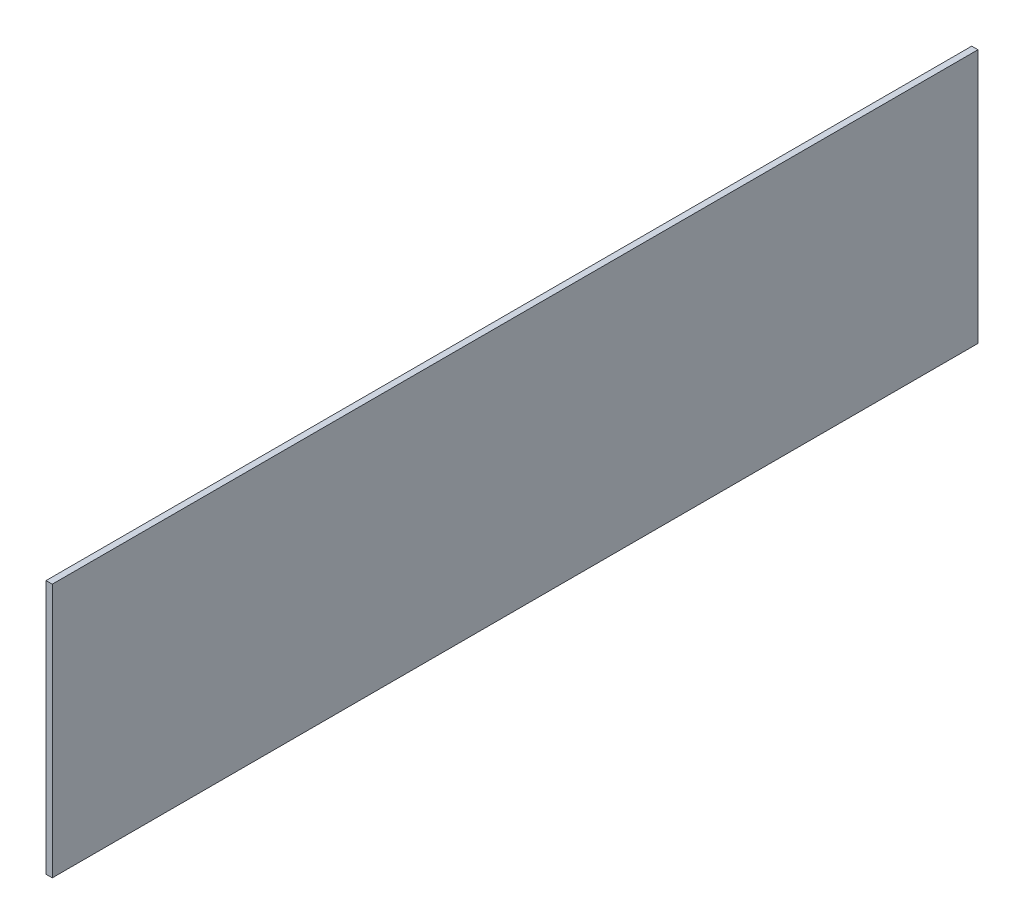
ISO-10303-21;
HEADER;
FILE_DESCRIPTION(('STEP AP214'),'2;1');
FILE_NAME('part.step','',(''),(''),'','','');
FILE_SCHEMA(('AUTOMOTIVE_DESIGN { 1 0 10303 214 1 1 1 1 }'));
ENDSEC;
DATA;
#1=APPLICATION_CONTEXT('core data for automotive mechanical design processes');
#2=APPLICATION_PROTOCOL_DEFINITION('international standard','automotive_design',2000,#1);
#3=PRODUCT_CONTEXT('',#1,'mechanical');
#4=PRODUCT('Part','Part','',(#3));
#5=PRODUCT_RELATED_PRODUCT_CATEGORY('part','',(#4));
#6=PRODUCT_DEFINITION_FORMATION('','',#4);
#7=PRODUCT_DEFINITION_CONTEXT('part definition',#1,'design');
#8=PRODUCT_DEFINITION('design','',#6,#7);
#9=PRODUCT_DEFINITION_SHAPE('','',#8);
#10=(LENGTH_UNIT() NAMED_UNIT(*) SI_UNIT(.MILLI.,.METRE.));
#11=(NAMED_UNIT(*) PLANE_ANGLE_UNIT() SI_UNIT($,.RADIAN.));
#12=(NAMED_UNIT(*) SI_UNIT($,.STERADIAN.) SOLID_ANGLE_UNIT());
#13=UNCERTAINTY_MEASURE_WITH_UNIT(LENGTH_MEASURE(1.E-05),#10,'distance_accuracy_value','');
#14=(GEOMETRIC_REPRESENTATION_CONTEXT(3) GLOBAL_UNCERTAINTY_ASSIGNED_CONTEXT((#13)) GLOBAL_UNIT_ASSIGNED_CONTEXT((#10,
#11,#12)) REPRESENTATION_CONTEXT('',''));
#15=CARTESIAN_POINT('',(0.,0.,0.));
#16=DIRECTION('',(0.,0.,1.));
#17=DIRECTION('',(1.,0.,0.));
#18=AXIS2_PLACEMENT_3D('',#15,#16,#17);
#19=CARTESIAN_POINT('',(-81.2307692307691,158.76923076923,1776.));
#20=DIRECTION('',(1.,0.,0.));
#21=DIRECTION('',(0.,1.,0.));
#22=AXIS2_PLACEMENT_3D('',#19,#20,#21);
#23=PLANE('',#22);
#24=DIRECTION('',(0.,-1.,0.));
#25=VECTOR('',#24,1.);
#26=CARTESIAN_POINT('',(-81.2307692307691,158.76923076923,0.));
#27=LINE('',#26,#25);
#28=CARTESIAN_POINT('',(-81.2307692307691,158.76923076923,0.));
#29=VERTEX_POINT('',#28);
#30=CARTESIAN_POINT('',(-81.230769230769,-329.23076923077,0.));
#31=VERTEX_POINT('',#30);
#32=EDGE_CURVE('E107',#29,#31,#27,.T.);
#33=ORIENTED_EDGE('',*,*,#32,.T.);
#34=DIRECTION('',(0.,0.,-1.));
#35=VECTOR('',#34,1.);
#36=CARTESIAN_POINT('',(-81.230769230769,-329.23076923077,1776.));
#37=LINE('',#36,#35);
#38=CARTESIAN_POINT('',(-81.230769230769,-329.23076923077,1776.));
#39=VERTEX_POINT('',#38);
#40=EDGE_CURVE('E11',#39,#31,#37,.T.);
#41=ORIENTED_EDGE('',*,*,#40,.F.);
#42=DIRECTION('',(0.,-1.,0.));
#43=VECTOR('',#42,1.);
#44=CARTESIAN_POINT('',(-81.2307692307691,158.76923076923,1776.));
#45=LINE('',#44,#43);
#46=CARTESIAN_POINT('',(-81.2307692307691,158.76923076923,1776.));
#47=VERTEX_POINT('',#46);
#48=EDGE_CURVE('E91',#47,#39,#45,.T.);
#49=ORIENTED_EDGE('',*,*,#48,.F.);
#50=DIRECTION('',(0.,0.,-1.));
#51=VECTOR('',#50,1.);
#52=CARTESIAN_POINT('',(-81.2307692307691,158.76923076923,1776.));
#53=LINE('',#52,#51);
#54=EDGE_CURVE('E103',#47,#29,#53,.T.);
#55=ORIENTED_EDGE('',*,*,#54,.T.);
#56=EDGE_LOOP('',(#33,#41,#49,#55));
#57=FACE_BOUND('',#56,.T.);
#58=ADVANCED_FACE('F39',(#57),#23,.F.);
#59=CARTESIAN_POINT('',(-81.230769230769,-329.23076923077,1776.));
#60=DIRECTION('',(0.,1.,0.));
#61=DIRECTION('',(0.,0.,1.));
#62=AXIS2_PLACEMENT_3D('',#59,#60,#61);
#63=PLANE('',#62);
#64=DIRECTION('',(1.,0.,0.));
#65=VECTOR('',#64,1.);
#66=CARTESIAN_POINT('',(-81.230769230769,-329.23076923077,0.));
#67=LINE('',#66,#65);
#68=CARTESIAN_POINT('',(-69.2307692307691,-329.23076923077,0.));
#69=VERTEX_POINT('',#68);
#70=EDGE_CURVE('E96',#31,#69,#67,.T.);
#71=ORIENTED_EDGE('',*,*,#70,.T.);
#72=DIRECTION('',(0.,0.,-1.));
#73=VECTOR('',#72,1.);
#74=CARTESIAN_POINT('',(-69.2307692307691,-329.23076923077,1776.));
#75=LINE('',#74,#73);
#76=CARTESIAN_POINT('',(-69.2307692307691,-329.23076923077,1776.));
#77=VERTEX_POINT('',#76);
#78=EDGE_CURVE('E48',#77,#69,#75,.T.);
#79=ORIENTED_EDGE('',*,*,#78,.F.);
#80=DIRECTION('',(1.,0.,0.));
#81=VECTOR('',#80,1.);
#82=CARTESIAN_POINT('',(-81.230769230769,-329.23076923077,1776.));
#83=LINE('',#82,#81);
#84=EDGE_CURVE('E86',#39,#77,#83,.T.);
#85=ORIENTED_EDGE('',*,*,#84,.F.);
#86=ORIENTED_EDGE('',*,*,#40,.T.);
#87=EDGE_LOOP('',(#71,#79,#85,#86));
#88=FACE_BOUND('',#87,.T.);
#89=ADVANCED_FACE('F95',(#88),#63,.F.);
#90=CARTESIAN_POINT('',(-69.2307692307691,158.76923076923,1776.));
#91=DIRECTION('',(-1.,0.,0.));
#92=DIRECTION('',(0.,-1.,0.));
#93=AXIS2_PLACEMENT_3D('',#90,#91,#92);
#94=PLANE('',#93);
#95=DIRECTION('',(0.,1.,0.));
#96=VECTOR('',#95,1.);
#97=CARTESIAN_POINT('',(-69.2307692307691,158.76923076923,0.));
#98=LINE('',#97,#96);
#99=CARTESIAN_POINT('',(-69.2307692307691,158.76923076923,0.));
#100=VERTEX_POINT('',#99);
#101=EDGE_CURVE('E73',#69,#100,#98,.T.);
#102=ORIENTED_EDGE('',*,*,#101,.T.);
#103=DIRECTION('',(0.,0.,-1.));
#104=VECTOR('',#103,1.);
#105=CARTESIAN_POINT('',(-69.2307692307691,158.76923076923,1776.));
#106=LINE('',#105,#104);
#107=CARTESIAN_POINT('',(-69.2307692307691,158.76923076923,1776.));
#108=VERTEX_POINT('',#107);
#109=EDGE_CURVE('E98',#108,#100,#106,.T.);
#110=ORIENTED_EDGE('',*,*,#109,.F.);
#111=DIRECTION('',(0.,1.,0.));
#112=VECTOR('',#111,1.);
#113=CARTESIAN_POINT('',(-69.2307692307691,158.76923076923,1776.));
#114=LINE('',#113,#112);
#115=EDGE_CURVE('E89',#77,#108,#114,.T.);
#116=ORIENTED_EDGE('',*,*,#115,.F.);
#117=ORIENTED_EDGE('',*,*,#78,.T.);
#118=EDGE_LOOP('',(#102,#110,#116,#117));
#119=FACE_BOUND('',#118,.T.);
#120=ADVANCED_FACE('F99',(#119),#94,.F.);
#121=CARTESIAN_POINT('',(-81.2307692307691,158.76923076923,1776.));
#122=DIRECTION('',(0.,-1.,0.));
#123=DIRECTION('',(0.,0.,-1.));
#124=AXIS2_PLACEMENT_3D('',#121,#122,#123);
#125=PLANE('',#124);
#126=DIRECTION('',(-1.,0.,0.));
#127=VECTOR('',#126,1.);
#128=CARTESIAN_POINT('',(-81.2307692307691,158.76923076923,0.));
#129=LINE('',#128,#127);
#130=EDGE_CURVE('E79',#100,#29,#129,.T.);
#131=ORIENTED_EDGE('',*,*,#130,.T.);
#132=ORIENTED_EDGE('',*,*,#54,.F.);
#133=DIRECTION('',(-1.,0.,0.));
#134=VECTOR('',#133,1.);
#135=CARTESIAN_POINT('',(-81.2307692307691,158.76923076923,1776.));
#136=LINE('',#135,#134);
#137=EDGE_CURVE('E56',#108,#47,#136,.T.);
#138=ORIENTED_EDGE('',*,*,#137,.F.);
#139=ORIENTED_EDGE('',*,*,#109,.T.);
#140=EDGE_LOOP('',(#131,#132,#138,#139));
#141=FACE_BOUND('',#140,.T.);
#142=ADVANCED_FACE('F120',(#141),#125,.F.);
#143=CARTESIAN_POINT('',(0.,0.,1776.));
#144=DIRECTION('',(0.,0.,1.));
#145=DIRECTION('',(1.,0.,0.));
#146=AXIS2_PLACEMENT_3D('',#143,#144,#145);
#147=PLANE('',#146);
#148=ORIENTED_EDGE('',*,*,#48,.T.);
#149=ORIENTED_EDGE('',*,*,#84,.T.);
#150=ORIENTED_EDGE('',*,*,#115,.T.);
#151=ORIENTED_EDGE('',*,*,#137,.T.);
#152=EDGE_LOOP('',(#148,#149,#150,#151));
#153=FACE_BOUND('',#152,.T.);
#154=ADVANCED_FACE('F87',(#153),#147,.T.);
#155=CARTESIAN_POINT('',(0.,0.,0.));
#156=DIRECTION('',(0.,0.,1.));
#157=DIRECTION('',(1.,0.,0.));
#158=AXIS2_PLACEMENT_3D('',#155,#156,#157);
#159=PLANE('',#158);
#160=ORIENTED_EDGE('',*,*,#32,.F.);
#161=ORIENTED_EDGE('',*,*,#130,.F.);
#162=ORIENTED_EDGE('',*,*,#101,.F.);
#163=ORIENTED_EDGE('',*,*,#70,.F.);
#164=EDGE_LOOP('',(#160,#161,#162,#163));
#165=FACE_BOUND('',#164,.T.);
#166=ADVANCED_FACE('F123',(#165),#159,.F.);
#167=CLOSED_SHELL('',(#58,#89,#120,#142,#154,#166));
#168=MANIFOLD_SOLID_BREP('B2',#167);
#169=ADVANCED_BREP_SHAPE_REPRESENTATION('',(#18,#168),#14);
#170=SHAPE_DEFINITION_REPRESENTATION(#9,#169);
ENDSEC;
END-ISO-10303-21;
